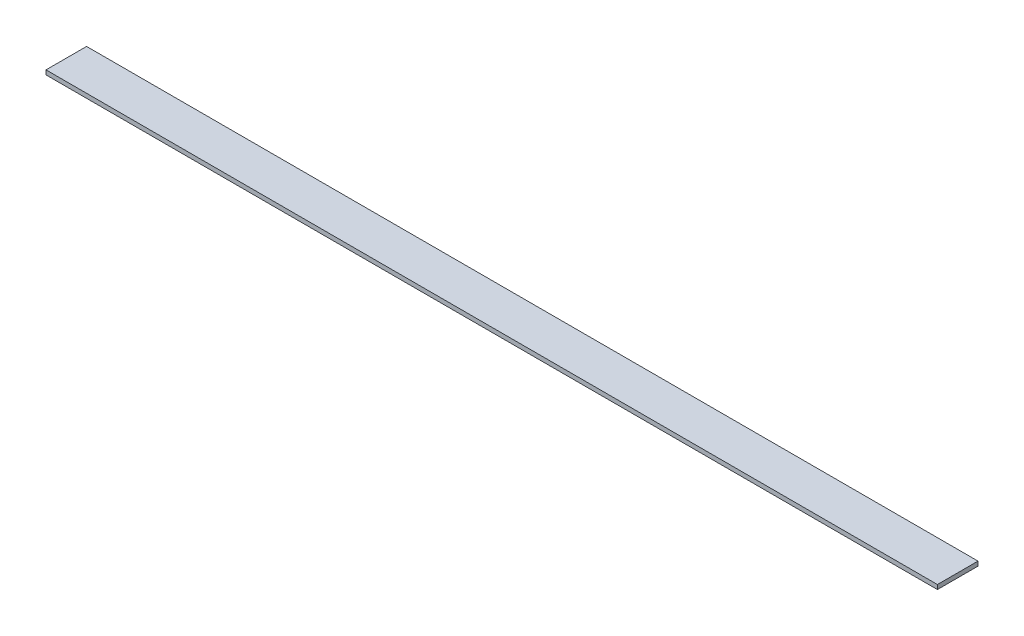
ISO-10303-21;
HEADER;
FILE_DESCRIPTION(('STEP AP214'),'2;1');
FILE_NAME('part.step','',(''),(''),'','','');
FILE_SCHEMA(('AUTOMOTIVE_DESIGN { 1 0 10303 214 1 1 1 1 }'));
ENDSEC;
DATA;
#1=APPLICATION_CONTEXT('core data for automotive mechanical design processes');
#2=APPLICATION_PROTOCOL_DEFINITION('international standard','automotive_design',2000,#1);
#3=PRODUCT_CONTEXT('',#1,'mechanical');
#4=PRODUCT('Part','Part','',(#3));
#5=PRODUCT_RELATED_PRODUCT_CATEGORY('part','',(#4));
#6=PRODUCT_DEFINITION_FORMATION('','',#4);
#7=PRODUCT_DEFINITION_CONTEXT('part definition',#1,'design');
#8=PRODUCT_DEFINITION('design','',#6,#7);
#9=PRODUCT_DEFINITION_SHAPE('','',#8);
#10=(LENGTH_UNIT() NAMED_UNIT(*) SI_UNIT(.MILLI.,.METRE.));
#11=(NAMED_UNIT(*) PLANE_ANGLE_UNIT() SI_UNIT($,.RADIAN.));
#12=(NAMED_UNIT(*) SI_UNIT($,.STERADIAN.) SOLID_ANGLE_UNIT());
#13=UNCERTAINTY_MEASURE_WITH_UNIT(LENGTH_MEASURE(1.E-05),#10,'distance_accuracy_value','');
#14=(GEOMETRIC_REPRESENTATION_CONTEXT(3) GLOBAL_UNCERTAINTY_ASSIGNED_CONTEXT((#13)) GLOBAL_UNIT_ASSIGNED_CONTEXT((#10,
#11,#12)) REPRESENTATION_CONTEXT('',''));
#15=CARTESIAN_POINT('',(0.,0.,0.));
#16=DIRECTION('',(0.,0.,1.));
#17=DIRECTION('',(1.,0.,0.));
#18=AXIS2_PLACEMENT_3D('',#15,#16,#17);
#19=CARTESIAN_POINT('',(203.2,2.,-9.25));
#20=DIRECTION('',(-1.,0.,0.));
#21=DIRECTION('',(0.,0.,1.));
#22=AXIS2_PLACEMENT_3D('',#19,#20,#21);
#23=PLANE('',#22);
#24=DIRECTION('',(0.,0.,-1.));
#25=VECTOR('',#24,1.);
#26=CARTESIAN_POINT('',(203.2,0.,-9.25));
#27=LINE('',#26,#25);
#28=CARTESIAN_POINT('',(203.2,0.,9.25));
#29=VERTEX_POINT('',#28);
#30=CARTESIAN_POINT('',(203.2,0.,-9.25));
#31=VERTEX_POINT('',#30);
#32=EDGE_CURVE('E96',#29,#31,#27,.T.);
#33=ORIENTED_EDGE('',*,*,#32,.T.);
#34=DIRECTION('',(0.,-1.,0.));
#35=VECTOR('',#34,1.);
#36=CARTESIAN_POINT('',(203.2,2.,-9.25));
#37=LINE('',#36,#35);
#38=CARTESIAN_POINT('',(203.2,2.,-9.25));
#39=VERTEX_POINT('',#38);
#40=EDGE_CURVE('E11',#39,#31,#37,.T.);
#41=ORIENTED_EDGE('',*,*,#40,.F.);
#42=DIRECTION('',(0.,0.,-1.));
#43=VECTOR('',#42,1.);
#44=CARTESIAN_POINT('',(203.2,2.,-9.25));
#45=LINE('',#44,#43);
#46=CARTESIAN_POINT('',(203.2,2.,9.25));
#47=VERTEX_POINT('',#46);
#48=EDGE_CURVE('E84',#47,#39,#45,.T.);
#49=ORIENTED_EDGE('',*,*,#48,.F.);
#50=DIRECTION('',(0.,-1.,0.));
#51=VECTOR('',#50,1.);
#52=CARTESIAN_POINT('',(203.2,2.,9.25));
#53=LINE('',#52,#51);
#54=EDGE_CURVE('E92',#47,#29,#53,.T.);
#55=ORIENTED_EDGE('',*,*,#54,.T.);
#56=EDGE_LOOP('',(#33,#41,#49,#55));
#57=FACE_BOUND('',#56,.T.);
#58=ADVANCED_FACE('F33',(#57),#23,.F.);
#59=CARTESIAN_POINT('',(-203.2,2.,-9.25));
#60=DIRECTION('',(0.,0.,1.));
#61=DIRECTION('',(1.,0.,0.));
#62=AXIS2_PLACEMENT_3D('',#59,#60,#61);
#63=PLANE('',#62);
#64=DIRECTION('',(-1.,0.,0.));
#65=VECTOR('',#64,1.);
#66=CARTESIAN_POINT('',(-203.2,0.,-9.25));
#67=LINE('',#66,#65);
#68=CARTESIAN_POINT('',(-203.2,0.,-9.25));
#69=VERTEX_POINT('',#68);
#70=EDGE_CURVE('E88',#31,#69,#67,.T.);
#71=ORIENTED_EDGE('',*,*,#70,.T.);
#72=DIRECTION('',(0.,-1.,0.));
#73=VECTOR('',#72,1.);
#74=CARTESIAN_POINT('',(-203.2,2.,-9.25));
#75=LINE('',#74,#73);
#76=CARTESIAN_POINT('',(-203.2,2.,-9.25));
#77=VERTEX_POINT('',#76);
#78=EDGE_CURVE('E41',#77,#69,#75,.T.);
#79=ORIENTED_EDGE('',*,*,#78,.F.);
#80=DIRECTION('',(-1.,0.,0.));
#81=VECTOR('',#80,1.);
#82=CARTESIAN_POINT('',(-203.2,2.,-9.25));
#83=LINE('',#82,#81);
#84=EDGE_CURVE('E79',#39,#77,#83,.T.);
#85=ORIENTED_EDGE('',*,*,#84,.F.);
#86=ORIENTED_EDGE('',*,*,#40,.T.);
#87=EDGE_LOOP('',(#71,#79,#85,#86));
#88=FACE_BOUND('',#87,.T.);
#89=ADVANCED_FACE('F87',(#88),#63,.F.);
#90=CARTESIAN_POINT('',(-203.2,2.,-9.25));
#91=DIRECTION('',(1.,0.,0.));
#92=DIRECTION('',(0.,0.,-1.));
#93=AXIS2_PLACEMENT_3D('',#90,#91,#92);
#94=PLANE('',#93);
#95=DIRECTION('',(0.,0.,1.));
#96=VECTOR('',#95,1.);
#97=CARTESIAN_POINT('',(-203.2,0.,-9.25));
#98=LINE('',#97,#96);
#99=CARTESIAN_POINT('',(-203.2,0.,9.25));
#100=VERTEX_POINT('',#99);
#101=EDGE_CURVE('E66',#69,#100,#98,.T.);
#102=ORIENTED_EDGE('',*,*,#101,.T.);
#103=DIRECTION('',(0.,-1.,0.));
#104=VECTOR('',#103,1.);
#105=CARTESIAN_POINT('',(-203.2,2.,9.25));
#106=LINE('',#105,#104);
#107=CARTESIAN_POINT('',(-203.2,2.,9.25));
#108=VERTEX_POINT('',#107);
#109=EDGE_CURVE('E89',#108,#100,#106,.T.);
#110=ORIENTED_EDGE('',*,*,#109,.F.);
#111=DIRECTION('',(0.,0.,1.));
#112=VECTOR('',#111,1.);
#113=CARTESIAN_POINT('',(-203.2,2.,-9.25));
#114=LINE('',#113,#112);
#115=EDGE_CURVE('E82',#77,#108,#114,.T.);
#116=ORIENTED_EDGE('',*,*,#115,.F.);
#117=ORIENTED_EDGE('',*,*,#78,.T.);
#118=EDGE_LOOP('',(#102,#110,#116,#117));
#119=FACE_BOUND('',#118,.T.);
#120=ADVANCED_FACE('F90',(#119),#94,.F.);
#121=CARTESIAN_POINT('',(-203.2,2.,9.25));
#122=DIRECTION('',(0.,0.,-1.));
#123=DIRECTION('',(-1.,0.,0.));
#124=AXIS2_PLACEMENT_3D('',#121,#122,#123);
#125=PLANE('',#124);
#126=DIRECTION('',(1.,0.,0.));
#127=VECTOR('',#126,1.);
#128=CARTESIAN_POINT('',(-203.2,0.,9.25));
#129=LINE('',#128,#127);
#130=EDGE_CURVE('E72',#100,#29,#129,.T.);
#131=ORIENTED_EDGE('',*,*,#130,.T.);
#132=ORIENTED_EDGE('',*,*,#54,.F.);
#133=DIRECTION('',(1.,0.,0.));
#134=VECTOR('',#133,1.);
#135=CARTESIAN_POINT('',(-203.2,2.,9.25));
#136=LINE('',#135,#134);
#137=EDGE_CURVE('E49',#108,#47,#136,.T.);
#138=ORIENTED_EDGE('',*,*,#137,.F.);
#139=ORIENTED_EDGE('',*,*,#109,.T.);
#140=EDGE_LOOP('',(#131,#132,#138,#139));
#141=FACE_BOUND('',#140,.T.);
#142=ADVANCED_FACE('F103',(#141),#125,.F.);
#143=CARTESIAN_POINT('',(0.,2.,0.));
#144=DIRECTION('',(0.,1.,0.));
#145=DIRECTION('',(0.,0.,1.));
#146=AXIS2_PLACEMENT_3D('',#143,#144,#145);
#147=PLANE('',#146);
#148=ORIENTED_EDGE('',*,*,#48,.T.);
#149=ORIENTED_EDGE('',*,*,#84,.T.);
#150=ORIENTED_EDGE('',*,*,#115,.T.);
#151=ORIENTED_EDGE('',*,*,#137,.T.);
#152=EDGE_LOOP('',(#148,#149,#150,#151));
#153=FACE_BOUND('',#152,.T.);
#154=ADVANCED_FACE('F80',(#153),#147,.T.);
#155=CARTESIAN_POINT('',(0.,0.,0.));
#156=DIRECTION('',(0.,1.,0.));
#157=DIRECTION('',(0.,0.,1.));
#158=AXIS2_PLACEMENT_3D('',#155,#156,#157);
#159=PLANE('',#158);
#160=ORIENTED_EDGE('',*,*,#32,.F.);
#161=ORIENTED_EDGE('',*,*,#130,.F.);
#162=ORIENTED_EDGE('',*,*,#101,.F.);
#163=ORIENTED_EDGE('',*,*,#70,.F.);
#164=EDGE_LOOP('',(#160,#161,#162,#163));
#165=FACE_BOUND('',#164,.T.);
#166=ADVANCED_FACE('F106',(#165),#159,.F.);
#167=CLOSED_SHELL('',(#58,#89,#120,#142,#154,#166));
#168=MANIFOLD_SOLID_BREP('B2',#167);
#169=ADVANCED_BREP_SHAPE_REPRESENTATION('',(#18,#168),#14);
#170=SHAPE_DEFINITION_REPRESENTATION(#9,#169);
ENDSEC;
END-ISO-10303-21;
